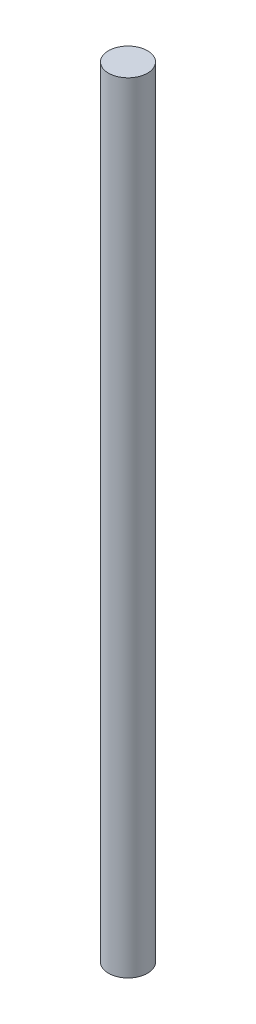
ISO-10303-21;
HEADER;
FILE_DESCRIPTION(('STEP AP214'),'2;1');
FILE_NAME('part.step','',(''),(''),'','','');
FILE_SCHEMA(('AUTOMOTIVE_DESIGN { 1 0 10303 214 1 1 1 1 }'));
ENDSEC;
DATA;
#1=APPLICATION_CONTEXT('core data for automotive mechanical design processes');
#2=APPLICATION_PROTOCOL_DEFINITION('international standard','automotive_design',2000,#1);
#3=PRODUCT_CONTEXT('',#1,'mechanical');
#4=PRODUCT('Part','Part','',(#3));
#5=PRODUCT_RELATED_PRODUCT_CATEGORY('part','',(#4));
#6=PRODUCT_DEFINITION_FORMATION('','',#4);
#7=PRODUCT_DEFINITION_CONTEXT('part definition',#1,'design');
#8=PRODUCT_DEFINITION('design','',#6,#7);
#9=PRODUCT_DEFINITION_SHAPE('','',#8);
#10=(LENGTH_UNIT() NAMED_UNIT(*) SI_UNIT(.MILLI.,.METRE.));
#11=(NAMED_UNIT(*) PLANE_ANGLE_UNIT() SI_UNIT($,.RADIAN.));
#12=(NAMED_UNIT(*) SI_UNIT($,.STERADIAN.) SOLID_ANGLE_UNIT());
#13=UNCERTAINTY_MEASURE_WITH_UNIT(LENGTH_MEASURE(1.E-05),#10,'distance_accuracy_value','');
#14=(GEOMETRIC_REPRESENTATION_CONTEXT(3) GLOBAL_UNCERTAINTY_ASSIGNED_CONTEXT((#13)) GLOBAL_UNIT_ASSIGNED_CONTEXT((#10,
#11,#12)) REPRESENTATION_CONTEXT('',''));
#15=CARTESIAN_POINT('',(0.,0.,0.));
#16=DIRECTION('',(0.,0.,1.));
#17=DIRECTION('',(1.,0.,0.));
#18=AXIS2_PLACEMENT_3D('',#15,#16,#17);
#19=CARTESIAN_POINT('',(0.,500.,0.));
#20=DIRECTION('',(0.,-1.,0.));
#21=DIRECTION('',(0.,0.,-1.));
#22=AXIS2_PLACEMENT_3D('',#19,#20,#21);
#23=CYLINDRICAL_SURFACE('',#22,12.5);
#24=CARTESIAN_POINT('',(0.,500.,0.));
#25=DIRECTION('',(0.,1.,0.));
#26=DIRECTION('',(0.,0.,1.));
#27=AXIS2_PLACEMENT_3D('',#24,#25,#26);
#28=CIRCLE('',#27,12.5);
#29=CARTESIAN_POINT('',(0.,500.,12.5));
#30=VERTEX_POINT('',#29);
#31=EDGE_CURVE('E10',#30,#30,#28,.T.);
#32=ORIENTED_EDGE('',*,*,#31,.F.);
#33=EDGE_LOOP('',(#32));
#34=FACE_BOUND('',#33,.T.);
#35=CARTESIAN_POINT('',(0.,0.,0.));
#36=DIRECTION('',(0.,1.,0.));
#37=DIRECTION('',(0.,0.,1.));
#38=AXIS2_PLACEMENT_3D('',#35,#36,#37);
#39=CIRCLE('',#38,12.5);
#40=CARTESIAN_POINT('',(0.,0.,12.5));
#41=VERTEX_POINT('',#40);
#42=EDGE_CURVE('E40',#41,#41,#39,.T.);
#43=ORIENTED_EDGE('',*,*,#42,.T.);
#44=EDGE_LOOP('',(#43));
#45=FACE_BOUND('',#44,.T.);
#46=ADVANCED_FACE('F37',(#34,#45),#23,.T.);
#47=CARTESIAN_POINT('',(0.,500.,0.));
#48=DIRECTION('',(0.,1.,0.));
#49=DIRECTION('',(0.,0.,1.));
#50=AXIS2_PLACEMENT_3D('',#47,#48,#49);
#51=PLANE('',#50);
#52=ORIENTED_EDGE('',*,*,#31,.T.);
#53=EDGE_LOOP('',(#52));
#54=FACE_BOUND('',#53,.T.);
#55=ADVANCED_FACE('F52',(#54),#51,.T.);
#56=CARTESIAN_POINT('',(0.,0.,0.));
#57=DIRECTION('',(0.,1.,0.));
#58=DIRECTION('',(0.,0.,1.));
#59=AXIS2_PLACEMENT_3D('',#56,#57,#58);
#60=PLANE('',#59);
#61=ORIENTED_EDGE('',*,*,#42,.F.);
#62=EDGE_LOOP('',(#61));
#63=FACE_BOUND('',#62,.T.);
#64=ADVANCED_FACE('F50',(#63),#60,.F.);
#65=CLOSED_SHELL('',(#46,#55,#64));
#66=MANIFOLD_SOLID_BREP('B2',#65);
#67=ADVANCED_BREP_SHAPE_REPRESENTATION('',(#18,#66),#14);
#68=SHAPE_DEFINITION_REPRESENTATION(#9,#67);
ENDSEC;
END-ISO-10303-21;
